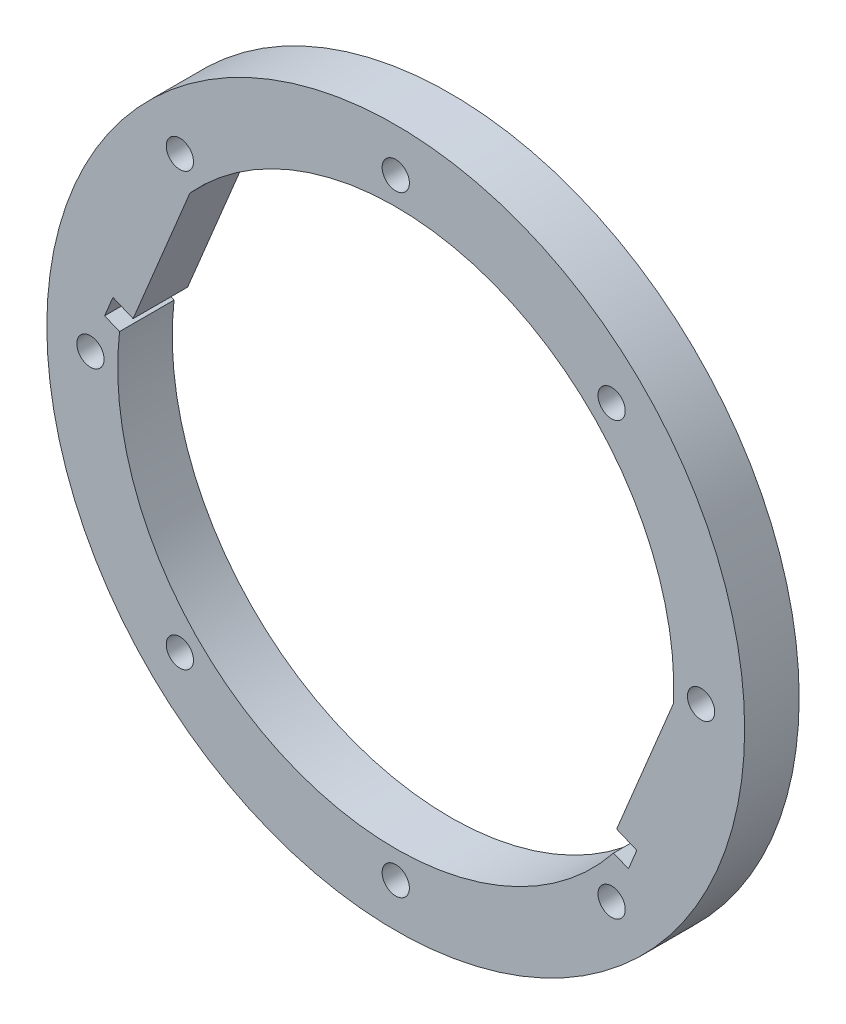
ISO-10303-21;
HEADER;
FILE_DESCRIPTION(('STEP AP214'),'2;1');
FILE_NAME('part.step','',(''),(''),'','','');
FILE_SCHEMA(('AUTOMOTIVE_DESIGN { 1 0 10303 214 1 1 1 1 }'));
ENDSEC;
DATA;
#1=APPLICATION_CONTEXT('core data for automotive mechanical design processes');
#2=APPLICATION_PROTOCOL_DEFINITION('international standard','automotive_design',2000,#1);
#3=PRODUCT_CONTEXT('',#1,'mechanical');
#4=PRODUCT('Part','Part','',(#3));
#5=PRODUCT_RELATED_PRODUCT_CATEGORY('part','',(#4));
#6=PRODUCT_DEFINITION_FORMATION('','',#4);
#7=PRODUCT_DEFINITION_CONTEXT('part definition',#1,'design');
#8=PRODUCT_DEFINITION('design','',#6,#7);
#9=PRODUCT_DEFINITION_SHAPE('','',#8);
#10=(LENGTH_UNIT() NAMED_UNIT(*) SI_UNIT(.MILLI.,.METRE.));
#11=(NAMED_UNIT(*) PLANE_ANGLE_UNIT() SI_UNIT($,.RADIAN.));
#12=(NAMED_UNIT(*) SI_UNIT($,.STERADIAN.) SOLID_ANGLE_UNIT());
#13=UNCERTAINTY_MEASURE_WITH_UNIT(LENGTH_MEASURE(1.E-05),#10,'distance_accuracy_value','');
#14=(GEOMETRIC_REPRESENTATION_CONTEXT(3) GLOBAL_UNCERTAINTY_ASSIGNED_CONTEXT((#13)) GLOBAL_UNIT_ASSIGNED_CONTEXT((#10,
#11,#12)) REPRESENTATION_CONTEXT('',''));
#15=CARTESIAN_POINT('',(0.,0.,0.));
#16=DIRECTION('',(0.,0.,1.));
#17=DIRECTION('',(1.,0.,0.));
#18=AXIS2_PLACEMENT_3D('',#15,#16,#17);
#19=CARTESIAN_POINT('',(0.,0.,5.));
#20=DIRECTION('',(0.,0.,-1.));
#21=DIRECTION('',(-1.,0.,0.));
#22=AXIS2_PLACEMENT_3D('',#19,#20,#21);
#23=CYLINDRICAL_SURFACE('',#22,32.);
#24=CARTESIAN_POINT('',(0.,0.,5.));
#25=DIRECTION('',(0.,0.,1.));
#26=DIRECTION('',(1.,0.,0.));
#27=AXIS2_PLACEMENT_3D('',#24,#25,#26);
#28=CIRCLE('',#27,32.);
#29=CARTESIAN_POINT('',(32.,0.,5.));
#30=VERTEX_POINT('',#29);
#31=EDGE_CURVE('E255',#30,#30,#28,.T.);
#32=ORIENTED_EDGE('',*,*,#31,.F.);
#33=EDGE_LOOP('',(#32));
#34=FACE_BOUND('',#33,.T.);
#35=CARTESIAN_POINT('',(0.,0.,0.));
#36=DIRECTION('',(0.,0.,1.));
#37=DIRECTION('',(1.,0.,0.));
#38=AXIS2_PLACEMENT_3D('',#35,#36,#37);
#39=CIRCLE('',#38,32.);
#40=CARTESIAN_POINT('',(32.,0.,0.));
#41=VERTEX_POINT('',#40);
#42=EDGE_CURVE('E195',#41,#41,#39,.T.);
#43=ORIENTED_EDGE('',*,*,#42,.T.);
#44=EDGE_LOOP('',(#43));
#45=FACE_BOUND('',#44,.T.);
#46=ADVANCED_FACE('F39',(#34,#45),#23,.T.);
#47=CARTESIAN_POINT('',(0.,0.,5.));
#48=DIRECTION('',(0.,0.,1.));
#49=DIRECTION('',(1.,0.,0.));
#50=AXIS2_PLACEMENT_3D('',#47,#48,#49);
#51=PLANE('',#50);
#52=CARTESIAN_POINT('',(0.,0.,5.));
#53=DIRECTION('',(0.,0.,1.));
#54=DIRECTION('',(1.,0.,0.));
#55=AXIS2_PLACEMENT_3D('',#52,#53,#54);
#56=CIRCLE('',#55,25.5);
#57=CARTESIAN_POINT('',(-25.3326794111072,2.91639398128352,5.));
#58=VERTEX_POINT('',#57);
#59=CARTESIAN_POINT('',(19.9751113579959,-15.8507074364415,5.));
#60=VERTEX_POINT('',#59);
#61=EDGE_CURVE('E54',#58,#60,#56,.T.);
#62=ORIENTED_EDGE('',*,*,#61,.F.);
#63=DIRECTION('',(0.923879532511287,-0.38268343236509,0.));
#64=VECTOR('',#63,1.);
#65=CARTESIAN_POINT('',(-2.67878402655563,-6.467156727579,5.));
#66=LINE('',#65,#64);
#67=CARTESIAN_POINT('',(-26.6996518718491,3.48261251391334,5.));
#68=VERTEX_POINT('',#67);
#69=EDGE_CURVE('E161',#68,#58,#66,.T.);
#70=ORIENTED_EDGE('',*,*,#69,.F.);
#71=DIRECTION('',(-0.382683432365089,-0.923879532511287,0.));
#72=VECTOR('',#71,1.);
#73=CARTESIAN_POINT('',(-24.0208678452935,9.94976924149231,5.));
#74=LINE('',#73,#72);
#75=CARTESIAN_POINT('',(-25.9342850071189,5.33037157893591,5.));
#76=VERTEX_POINT('',#75);
#77=EDGE_CURVE('E157',#76,#68,#74,.T.);
#78=ORIENTED_EDGE('',*,*,#77,.F.);
#79=DIRECTION('',(-0.923879532511288,0.382683432365087,0.));
#80=VECTOR('',#79,1.);
#81=CARTESIAN_POINT('',(-1.9134171618254,-4.61939766255636,5.));
#82=LINE('',#81,#80);
#83=CARTESIAN_POINT('',(-24.0865259420963,4.56500471420574,5.));
#84=VERTEX_POINT('',#83);
#85=EDGE_CURVE('E153',#84,#76,#82,.T.);
#86=ORIENTED_EDGE('',*,*,#85,.F.);
#87=DIRECTION('',(-0.38268343236509,-0.923879532511287,0.));
#88=VECTOR('',#87,1.);
#89=CARTESIAN_POINT('',(-22.1731087802709,9.18440237676217,5.));
#90=LINE('',#89,#88);
#91=CARTESIAN_POINT('',(-18.8755853537507,17.1453281553102,5.));
#92=VERTEX_POINT('',#91);
#93=EDGE_CURVE('E149',#92,#84,#90,.T.);
#94=ORIENTED_EDGE('',*,*,#93,.F.);
#95=CARTESIAN_POINT('',(25.4706322067911,-1.22347659821417,5.));
#96=VERTEX_POINT('',#95);
#97=EDGE_CURVE('E148',#96,#92,#56,.T.);
#98=ORIENTED_EDGE('',*,*,#97,.F.);
#99=DIRECTION('',(-0.382683432365089,-0.923879532511287,0.));
#100=VECTOR('',#99,1.);
#101=CARTESIAN_POINT('',(22.1731087802709,-9.18440237676214,5.));
#102=LINE('',#101,#100);
#103=CARTESIAN_POINT('',(20.2596916184454,-13.8038000393186,5.));
#104=VERTEX_POINT('',#103);
#105=EDGE_CURVE('E142',#96,#104,#102,.T.);
#106=ORIENTED_EDGE('',*,*,#105,.T.);
#107=DIRECTION('',(0.923879532511285,-0.382683432365093,0.));
#108=VECTOR('',#107,1.);
#109=CARTESIAN_POINT('',(-1.91341716182544,-4.61939766255637,5.));
#110=LINE('',#109,#108);
#111=CARTESIAN_POINT('',(22.107450683468,-14.5691669040488,5.));
#112=VERTEX_POINT('',#111);
#113=EDGE_CURVE('E138',#104,#112,#110,.T.);
#114=ORIENTED_EDGE('',*,*,#113,.T.);
#115=DIRECTION('',(-0.382683432365098,-0.923879532511283,0.));
#116=VECTOR('',#115,1.);
#117=CARTESIAN_POINT('',(24.0208678452934,-9.94976924149258,5.));
#118=LINE('',#117,#116);
#119=CARTESIAN_POINT('',(21.3420838187378,-16.4169259690714,5.));
#120=VERTEX_POINT('',#119);
#121=EDGE_CURVE('E119',#112,#120,#118,.T.);
#122=ORIENTED_EDGE('',*,*,#121,.T.);
#123=DIRECTION('',(-0.923879532511285,0.382683432365093,0.));
#124=VECTOR('',#123,1.);
#125=CARTESIAN_POINT('',(-2.67878402655563,-6.46715672757894,5.));
#126=LINE('',#125,#124);
#127=EDGE_CURVE('E129',#120,#60,#126,.T.);
#128=ORIENTED_EDGE('',*,*,#127,.T.);
#129=EDGE_LOOP('',(#62,#70,#78,#86,#94,#98,#106,#114,#122,#128));
#130=FACE_BOUND('',#129,.T.);
#131=CARTESIAN_POINT('',(0.,28.,5.));
#132=DIRECTION('',(0.,0.,1.));
#133=DIRECTION('',(1.,0.,0.));
#134=AXIS2_PLACEMENT_3D('',#131,#132,#133);
#135=CIRCLE('',#134,1.25);
#136=CARTESIAN_POINT('',(1.25,28.,5.));
#137=VERTEX_POINT('',#136);
#138=EDGE_CURVE('E196',#137,#137,#135,.T.);
#139=ORIENTED_EDGE('',*,*,#138,.F.);
#140=EDGE_LOOP('',(#139));
#141=FACE_BOUND('',#140,.T.);
#142=CARTESIAN_POINT('',(-19.7989898732231,19.7989898732236,5.));
#143=DIRECTION('',(0.,0.,1.));
#144=DIRECTION('',(1.,0.,0.));
#145=AXIS2_PLACEMENT_3D('',#142,#143,#144);
#146=CIRCLE('',#145,1.25);
#147=CARTESIAN_POINT('',(-18.5489898732231,19.7989898732236,5.));
#148=VERTEX_POINT('',#147);
#149=EDGE_CURVE('E168',#148,#148,#146,.T.);
#150=ORIENTED_EDGE('',*,*,#149,.F.);
#151=EDGE_LOOP('',(#150));
#152=FACE_BOUND('',#151,.T.);
#153=CARTESIAN_POINT('',(-19.7989898732235,-19.7989898732232,5.));
#154=DIRECTION('',(0.,0.,1.));
#155=DIRECTION('',(1.,0.,0.));
#156=AXIS2_PLACEMENT_3D('',#153,#154,#155);
#157=CIRCLE('',#156,1.25);
#158=CARTESIAN_POINT('',(-18.5489898732235,-19.7989898732232,5.));
#159=VERTEX_POINT('',#158);
#160=EDGE_CURVE('E214',#159,#159,#157,.T.);
#161=ORIENTED_EDGE('',*,*,#160,.F.);
#162=EDGE_LOOP('',(#161));
#163=FACE_BOUND('',#162,.T.);
#164=CARTESIAN_POINT('',(-1.90819582357449E-13,-28.,5.));
#165=DIRECTION('',(0.,0.,1.));
#166=DIRECTION('',(1.,0.,0.));
#167=AXIS2_PLACEMENT_3D('',#164,#165,#166);
#168=CIRCLE('',#167,1.25);
#169=CARTESIAN_POINT('',(1.24999999999981,-28.,5.));
#170=VERTEX_POINT('',#169);
#171=EDGE_CURVE('E206',#170,#170,#168,.T.);
#172=ORIENTED_EDGE('',*,*,#171,.F.);
#173=EDGE_LOOP('',(#172));
#174=FACE_BOUND('',#173,.T.);
#175=CARTESIAN_POINT('',(-28.,2.89102075612391E-13,5.));
#176=DIRECTION('',(0.,0.,1.));
#177=DIRECTION('',(1.,0.,0.));
#178=AXIS2_PLACEMENT_3D('',#175,#176,#177);
#179=CIRCLE('',#178,1.25);
#180=CARTESIAN_POINT('',(-26.75,2.89102075612391E-13,5.));
#181=VERTEX_POINT('',#180);
#182=EDGE_CURVE('E244',#181,#181,#179,.T.);
#183=ORIENTED_EDGE('',*,*,#182,.F.);
#184=EDGE_LOOP('',(#183));
#185=FACE_BOUND('',#184,.T.);
#186=CARTESIAN_POINT('',(19.7989898732236,19.798989873223,5.));
#187=DIRECTION('',(0.,0.,1.));
#188=DIRECTION('',(1.,0.,0.));
#189=AXIS2_PLACEMENT_3D('',#186,#187,#188);
#190=CIRCLE('',#189,1.25);
#191=CARTESIAN_POINT('',(21.0489898732236,19.798989873223,5.));
#192=VERTEX_POINT('',#191);
#193=EDGE_CURVE('E229',#192,#192,#190,.T.);
#194=ORIENTED_EDGE('',*,*,#193,.F.);
#195=EDGE_LOOP('',(#194));
#196=FACE_BOUND('',#195,.T.);
#197=CARTESIAN_POINT('',(28.,-4.83987849797529E-13,5.));
#198=DIRECTION('',(0.,0.,1.));
#199=DIRECTION('',(1.,0.,0.));
#200=AXIS2_PLACEMENT_3D('',#197,#198,#199);
#201=CIRCLE('',#200,1.25);
#202=CARTESIAN_POINT('',(29.25,-4.83987849797529E-13,5.));
#203=VERTEX_POINT('',#202);
#204=EDGE_CURVE('E230',#203,#203,#201,.T.);
#205=ORIENTED_EDGE('',*,*,#204,.F.);
#206=EDGE_LOOP('',(#205));
#207=FACE_BOUND('',#206,.T.);
#208=CARTESIAN_POINT('',(19.7989898732232,-19.7989898732234,5.));
#209=DIRECTION('',(0.,0.,1.));
#210=DIRECTION('',(1.,0.,0.));
#211=AXIS2_PLACEMENT_3D('',#208,#209,#210);
#212=CIRCLE('',#211,1.25);
#213=CARTESIAN_POINT('',(21.0489898732232,-19.7989898732234,5.));
#214=VERTEX_POINT('',#213);
#215=EDGE_CURVE('E205',#214,#214,#212,.T.);
#216=ORIENTED_EDGE('',*,*,#215,.F.);
#217=EDGE_LOOP('',(#216));
#218=FACE_BOUND('',#217,.T.);
#219=ORIENTED_EDGE('',*,*,#31,.T.);
#220=EDGE_LOOP('',(#219));
#221=FACE_BOUND('',#220,.T.);
#222=ADVANCED_FACE('F134',(#130,#141,#152,#163,#174,#185,#196,#207,#218,#221),#51,.T.);
#223=CARTESIAN_POINT('',(0.,0.,0.));
#224=DIRECTION('',(0.,0.,1.));
#225=DIRECTION('',(1.,0.,0.));
#226=AXIS2_PLACEMENT_3D('',#223,#224,#225);
#227=PLANE('',#226);
#228=DIRECTION('',(0.923879532511287,-0.38268343236509,0.));
#229=VECTOR('',#228,1.);
#230=CARTESIAN_POINT('',(-2.67878402655563,-6.467156727579,0.));
#231=LINE('',#230,#229);
#232=CARTESIAN_POINT('',(-26.6996518718491,3.48261251391334,0.));
#233=VERTEX_POINT('',#232);
#234=CARTESIAN_POINT('',(-25.3326794111072,2.91639398128352,0.));
#235=VERTEX_POINT('',#234);
#236=EDGE_CURVE('E47',#233,#235,#231,.T.);
#237=ORIENTED_EDGE('',*,*,#236,.T.);
#238=CARTESIAN_POINT('',(0.,0.,0.));
#239=DIRECTION('',(0.,0.,1.));
#240=DIRECTION('',(1.,0.,0.));
#241=AXIS2_PLACEMENT_3D('',#238,#239,#240);
#242=CIRCLE('',#241,25.5);
#243=CARTESIAN_POINT('',(19.9751113579959,-15.8507074364415,0.));
#244=VERTEX_POINT('',#243);
#245=EDGE_CURVE('E11',#235,#244,#242,.T.);
#246=ORIENTED_EDGE('',*,*,#245,.T.);
#247=DIRECTION('',(-0.923879532511285,0.382683432365093,0.));
#248=VECTOR('',#247,1.);
#249=CARTESIAN_POINT('',(-2.67878402655563,-6.46715672757894,0.));
#250=LINE('',#249,#248);
#251=CARTESIAN_POINT('',(21.3420838187378,-16.4169259690714,0.));
#252=VERTEX_POINT('',#251);
#253=EDGE_CURVE('E259',#252,#244,#250,.T.);
#254=ORIENTED_EDGE('',*,*,#253,.F.);
#255=DIRECTION('',(-0.382683432365098,-0.923879532511283,0.));
#256=VECTOR('',#255,1.);
#257=CARTESIAN_POINT('',(24.0208678452934,-9.94976924149258,0.));
#258=LINE('',#257,#256);
#259=CARTESIAN_POINT('',(22.107450683468,-14.5691669040488,0.));
#260=VERTEX_POINT('',#259);
#261=EDGE_CURVE('E122',#260,#252,#258,.T.);
#262=ORIENTED_EDGE('',*,*,#261,.F.);
#263=DIRECTION('',(0.923879532511285,-0.382683432365093,0.));
#264=VECTOR('',#263,1.);
#265=CARTESIAN_POINT('',(-1.91341716182544,-4.61939766255637,0.));
#266=LINE('',#265,#264);
#267=CARTESIAN_POINT('',(20.2596916184454,-13.8038000393186,0.));
#268=VERTEX_POINT('',#267);
#269=EDGE_CURVE('E267',#268,#260,#266,.T.);
#270=ORIENTED_EDGE('',*,*,#269,.F.);
#271=DIRECTION('',(-0.382683432365089,-0.923879532511287,0.));
#272=VECTOR('',#271,1.);
#273=CARTESIAN_POINT('',(22.1731087802709,-9.18440237676214,0.));
#274=LINE('',#273,#272);
#275=CARTESIAN_POINT('',(25.4706322067911,-1.22347659821417,0.));
#276=VERTEX_POINT('',#275);
#277=EDGE_CURVE('E270',#276,#268,#274,.T.);
#278=ORIENTED_EDGE('',*,*,#277,.F.);
#279=CARTESIAN_POINT('',(0.,0.,0.));
#280=DIRECTION('',(0.,0.,1.));
#281=DIRECTION('',(1.,0.,0.));
#282=AXIS2_PLACEMENT_3D('',#279,#280,#281);
#283=CIRCLE('',#282,25.5);
#284=CARTESIAN_POINT('',(-18.8755853537507,17.1453281553102,0.));
#285=VERTEX_POINT('',#284);
#286=EDGE_CURVE('E273',#276,#285,#283,.T.);
#287=ORIENTED_EDGE('',*,*,#286,.T.);
#288=DIRECTION('',(-0.38268343236509,-0.923879532511287,0.));
#289=VECTOR('',#288,1.);
#290=CARTESIAN_POINT('',(-22.1731087802709,9.18440237676217,0.));
#291=LINE('',#290,#289);
#292=CARTESIAN_POINT('',(-24.0865259420963,4.56500471420574,0.));
#293=VERTEX_POINT('',#292);
#294=EDGE_CURVE('E277',#285,#293,#291,.T.);
#295=ORIENTED_EDGE('',*,*,#294,.T.);
#296=DIRECTION('',(-0.923879532511288,0.382683432365087,0.));
#297=VECTOR('',#296,1.);
#298=CARTESIAN_POINT('',(-1.9134171618254,-4.61939766255636,0.));
#299=LINE('',#298,#297);
#300=CARTESIAN_POINT('',(-25.9342850071189,5.33037157893591,0.));
#301=VERTEX_POINT('',#300);
#302=EDGE_CURVE('E281',#293,#301,#299,.T.);
#303=ORIENTED_EDGE('',*,*,#302,.T.);
#304=DIRECTION('',(-0.382683432365089,-0.923879532511287,0.));
#305=VECTOR('',#304,1.);
#306=CARTESIAN_POINT('',(-24.0208678452935,9.94976924149231,0.));
#307=LINE('',#306,#305);
#308=EDGE_CURVE('E285',#301,#233,#307,.T.);
#309=ORIENTED_EDGE('',*,*,#308,.T.);
#310=EDGE_LOOP('',(#237,#246,#254,#262,#270,#278,#287,#295,#303,#309));
#311=FACE_BOUND('',#310,.T.);
#312=CARTESIAN_POINT('',(0.,28.,0.));
#313=DIRECTION('',(0.,0.,1.));
#314=DIRECTION('',(1.,0.,0.));
#315=AXIS2_PLACEMENT_3D('',#312,#313,#314);
#316=CIRCLE('',#315,1.25);
#317=CARTESIAN_POINT('',(1.25,28.,0.));
#318=VERTEX_POINT('',#317);
#319=EDGE_CURVE('E191',#318,#318,#316,.T.);
#320=ORIENTED_EDGE('',*,*,#319,.T.);
#321=EDGE_LOOP('',(#320));
#322=FACE_BOUND('',#321,.T.);
#323=CARTESIAN_POINT('',(-19.7989898732231,19.7989898732236,0.));
#324=DIRECTION('',(0.,0.,1.));
#325=DIRECTION('',(1.,0.,0.));
#326=AXIS2_PLACEMENT_3D('',#323,#324,#325);
#327=CIRCLE('',#326,1.25);
#328=CARTESIAN_POINT('',(-18.5489898732231,19.7989898732236,0.));
#329=VERTEX_POINT('',#328);
#330=EDGE_CURVE('E218',#329,#329,#327,.T.);
#331=ORIENTED_EDGE('',*,*,#330,.T.);
#332=EDGE_LOOP('',(#331));
#333=FACE_BOUND('',#332,.T.);
#334=CARTESIAN_POINT('',(-19.7989898732235,-19.7989898732232,0.));
#335=DIRECTION('',(0.,0.,1.));
#336=DIRECTION('',(1.,0.,0.));
#337=AXIS2_PLACEMENT_3D('',#334,#335,#336);
#338=CIRCLE('',#337,1.25);
#339=CARTESIAN_POINT('',(-18.5489898732235,-19.7989898732232,0.));
#340=VERTEX_POINT('',#339);
#341=EDGE_CURVE('E210',#340,#340,#338,.T.);
#342=ORIENTED_EDGE('',*,*,#341,.T.);
#343=EDGE_LOOP('',(#342));
#344=FACE_BOUND('',#343,.T.);
#345=CARTESIAN_POINT('',(-1.90819582357449E-13,-28.,0.));
#346=DIRECTION('',(0.,0.,1.));
#347=DIRECTION('',(1.,0.,0.));
#348=AXIS2_PLACEMENT_3D('',#345,#346,#347);
#349=CIRCLE('',#348,1.25);
#350=CARTESIAN_POINT('',(1.24999999999981,-28.,0.));
#351=VERTEX_POINT('',#350);
#352=EDGE_CURVE('E201',#351,#351,#349,.T.);
#353=ORIENTED_EDGE('',*,*,#352,.T.);
#354=EDGE_LOOP('',(#353));
#355=FACE_BOUND('',#354,.T.);
#356=CARTESIAN_POINT('',(-28.,2.89102075612391E-13,0.));
#357=DIRECTION('',(0.,0.,1.));
#358=DIRECTION('',(1.,0.,0.));
#359=AXIS2_PLACEMENT_3D('',#356,#357,#358);
#360=CIRCLE('',#359,1.25);
#361=CARTESIAN_POINT('',(-26.75,2.89102075612391E-13,0.));
#362=VERTEX_POINT('',#361);
#363=EDGE_CURVE('E200',#362,#362,#360,.T.);
#364=ORIENTED_EDGE('',*,*,#363,.T.);
#365=EDGE_LOOP('',(#364));
#366=FACE_BOUND('',#365,.T.);
#367=CARTESIAN_POINT('',(19.7989898732236,19.798989873223,0.));
#368=DIRECTION('',(0.,0.,1.));
#369=DIRECTION('',(1.,0.,0.));
#370=AXIS2_PLACEMENT_3D('',#367,#368,#369);
#371=CIRCLE('',#370,1.25);
#372=CARTESIAN_POINT('',(21.0489898732236,19.798989873223,0.));
#373=VERTEX_POINT('',#372);
#374=EDGE_CURVE('E248',#373,#373,#371,.T.);
#375=ORIENTED_EDGE('',*,*,#374,.T.);
#376=EDGE_LOOP('',(#375));
#377=FACE_BOUND('',#376,.T.);
#378=CARTESIAN_POINT('',(28.,-4.83987849797529E-13,0.));
#379=DIRECTION('',(0.,0.,1.));
#380=DIRECTION('',(1.,0.,0.));
#381=AXIS2_PLACEMENT_3D('',#378,#379,#380);
#382=CIRCLE('',#381,1.25);
#383=CARTESIAN_POINT('',(29.25,-4.83987849797529E-13,0.));
#384=VERTEX_POINT('',#383);
#385=EDGE_CURVE('E225',#384,#384,#382,.T.);
#386=ORIENTED_EDGE('',*,*,#385,.T.);
#387=EDGE_LOOP('',(#386));
#388=FACE_BOUND('',#387,.T.);
#389=CARTESIAN_POINT('',(19.7989898732232,-19.7989898732234,0.));
#390=DIRECTION('',(0.,0.,1.));
#391=DIRECTION('',(1.,0.,0.));
#392=AXIS2_PLACEMENT_3D('',#389,#390,#391);
#393=CIRCLE('',#392,1.25);
#394=CARTESIAN_POINT('',(21.0489898732232,-19.7989898732234,0.));
#395=VERTEX_POINT('',#394);
#396=EDGE_CURVE('E234',#395,#395,#393,.T.);
#397=ORIENTED_EDGE('',*,*,#396,.T.);
#398=EDGE_LOOP('',(#397));
#399=FACE_BOUND('',#398,.T.);
#400=ORIENTED_EDGE('',*,*,#42,.F.);
#401=EDGE_LOOP('',(#400));
#402=FACE_BOUND('',#401,.T.);
#403=ADVANCED_FACE('F291',(#311,#322,#333,#344,#355,#366,#377,#388,#399,#402),#227,.F.);
#404=CARTESIAN_POINT('',(19.7989898732232,-19.7989898732234,0.));
#405=DIRECTION('',(0.,0.,1.));
#406=DIRECTION('',(1.,0.,0.));
#407=AXIS2_PLACEMENT_3D('',#404,#405,#406);
#408=CYLINDRICAL_SURFACE('',#407,1.25);
#409=ORIENTED_EDGE('',*,*,#396,.F.);
#410=EDGE_LOOP('',(#409));
#411=FACE_BOUND('',#410,.T.);
#412=ORIENTED_EDGE('',*,*,#215,.T.);
#413=EDGE_LOOP('',(#412));
#414=FACE_BOUND('',#413,.T.);
#415=ADVANCED_FACE('F349',(#411,#414),#408,.F.);
#416=CARTESIAN_POINT('',(28.,-4.83987849797529E-13,0.));
#417=DIRECTION('',(0.,0.,1.));
#418=DIRECTION('',(1.,0.,0.));
#419=AXIS2_PLACEMENT_3D('',#416,#417,#418);
#420=CYLINDRICAL_SURFACE('',#419,1.25);
#421=ORIENTED_EDGE('',*,*,#385,.F.);
#422=EDGE_LOOP('',(#421));
#423=FACE_BOUND('',#422,.T.);
#424=ORIENTED_EDGE('',*,*,#204,.T.);
#425=EDGE_LOOP('',(#424));
#426=FACE_BOUND('',#425,.T.);
#427=ADVANCED_FACE('F353',(#423,#426),#420,.F.);
#428=CARTESIAN_POINT('',(19.7989898732236,19.798989873223,0.));
#429=DIRECTION('',(0.,0.,1.));
#430=DIRECTION('',(1.,0.,0.));
#431=AXIS2_PLACEMENT_3D('',#428,#429,#430);
#432=CYLINDRICAL_SURFACE('',#431,1.25);
#433=ORIENTED_EDGE('',*,*,#374,.F.);
#434=EDGE_LOOP('',(#433));
#435=FACE_BOUND('',#434,.T.);
#436=ORIENTED_EDGE('',*,*,#193,.T.);
#437=EDGE_LOOP('',(#436));
#438=FACE_BOUND('',#437,.T.);
#439=ADVANCED_FACE('F357',(#435,#438),#432,.F.);
#440=CARTESIAN_POINT('',(-28.,2.89102075612391E-13,0.));
#441=DIRECTION('',(0.,0.,1.));
#442=DIRECTION('',(1.,0.,0.));
#443=AXIS2_PLACEMENT_3D('',#440,#441,#442);
#444=CYLINDRICAL_SURFACE('',#443,1.25);
#445=ORIENTED_EDGE('',*,*,#363,.F.);
#446=EDGE_LOOP('',(#445));
#447=FACE_BOUND('',#446,.T.);
#448=ORIENTED_EDGE('',*,*,#182,.T.);
#449=EDGE_LOOP('',(#448));
#450=FACE_BOUND('',#449,.T.);
#451=ADVANCED_FACE('F360',(#447,#450),#444,.F.);
#452=CARTESIAN_POINT('',(-1.90819582357449E-13,-28.,0.));
#453=DIRECTION('',(0.,0.,1.));
#454=DIRECTION('',(1.,0.,0.));
#455=AXIS2_PLACEMENT_3D('',#452,#453,#454);
#456=CYLINDRICAL_SURFACE('',#455,1.25);
#457=ORIENTED_EDGE('',*,*,#352,.F.);
#458=EDGE_LOOP('',(#457));
#459=FACE_BOUND('',#458,.T.);
#460=ORIENTED_EDGE('',*,*,#171,.T.);
#461=EDGE_LOOP('',(#460));
#462=FACE_BOUND('',#461,.T.);
#463=ADVANCED_FACE('F363',(#459,#462),#456,.F.);
#464=CARTESIAN_POINT('',(-19.7989898732235,-19.7989898732232,0.));
#465=DIRECTION('',(0.,0.,1.));
#466=DIRECTION('',(1.,0.,0.));
#467=AXIS2_PLACEMENT_3D('',#464,#465,#466);
#468=CYLINDRICAL_SURFACE('',#467,1.25);
#469=ORIENTED_EDGE('',*,*,#341,.F.);
#470=EDGE_LOOP('',(#469));
#471=FACE_BOUND('',#470,.T.);
#472=ORIENTED_EDGE('',*,*,#160,.T.);
#473=EDGE_LOOP('',(#472));
#474=FACE_BOUND('',#473,.T.);
#475=ADVANCED_FACE('F371',(#471,#474),#468,.F.);
#476=CARTESIAN_POINT('',(-19.7989898732231,19.7989898732236,0.));
#477=DIRECTION('',(0.,0.,1.));
#478=DIRECTION('',(1.,0.,0.));
#479=AXIS2_PLACEMENT_3D('',#476,#477,#478);
#480=CYLINDRICAL_SURFACE('',#479,1.25);
#481=ORIENTED_EDGE('',*,*,#330,.F.);
#482=EDGE_LOOP('',(#481));
#483=FACE_BOUND('',#482,.T.);
#484=ORIENTED_EDGE('',*,*,#149,.T.);
#485=EDGE_LOOP('',(#484));
#486=FACE_BOUND('',#485,.T.);
#487=ADVANCED_FACE('F332',(#483,#486),#480,.F.);
#488=CARTESIAN_POINT('',(0.,28.,0.));
#489=DIRECTION('',(0.,0.,1.));
#490=DIRECTION('',(1.,0.,0.));
#491=AXIS2_PLACEMENT_3D('',#488,#489,#490);
#492=CYLINDRICAL_SURFACE('',#491,1.25);
#493=ORIENTED_EDGE('',*,*,#319,.F.);
#494=EDGE_LOOP('',(#493));
#495=FACE_BOUND('',#494,.T.);
#496=ORIENTED_EDGE('',*,*,#138,.T.);
#497=EDGE_LOOP('',(#496));
#498=FACE_BOUND('',#497,.T.);
#499=ADVANCED_FACE('F325',(#495,#498),#492,.F.);
#500=CARTESIAN_POINT('',(0.,0.,-5.));
#501=DIRECTION('',(0.,0.,1.));
#502=DIRECTION('',(1.,0.,0.));
#503=AXIS2_PLACEMENT_3D('',#500,#501,#502);
#504=CYLINDRICAL_SURFACE('',#503,25.5);
#505=DIRECTION('',(0.,0.,1.));
#506=VECTOR('',#505,1.);
#507=CARTESIAN_POINT('',(-25.3326794111072,2.91639398128352,-5.));
#508=LINE('',#507,#506);
#509=EDGE_CURVE('E165',#235,#58,#508,.T.);
#510=ORIENTED_EDGE('',*,*,#509,.T.);
#511=ORIENTED_EDGE('',*,*,#61,.T.);
#512=DIRECTION('',(0.,0.,1.));
#513=VECTOR('',#512,1.);
#514=CARTESIAN_POINT('',(19.9751113579959,-15.8507074364415,-5.));
#515=LINE('',#514,#513);
#516=EDGE_CURVE('E126',#244,#60,#515,.T.);
#517=ORIENTED_EDGE('',*,*,#516,.F.);
#518=ORIENTED_EDGE('',*,*,#245,.F.);
#519=EDGE_LOOP('',(#510,#511,#517,#518));
#520=FACE_BOUND('',#519,.T.);
#521=ADVANCED_FACE('F323',(#520),#504,.F.);
#522=CARTESIAN_POINT('',(-2.67878402655563,-6.467156727579,-5.));
#523=DIRECTION('',(-0.38268343236509,-0.923879532511287,0.));
#524=DIRECTION('',(0.923879532511287,-0.38268343236509,0.));
#525=AXIS2_PLACEMENT_3D('',#522,#523,#524);
#526=PLANE('',#525);
#527=DIRECTION('',(0.,0.,1.));
#528=VECTOR('',#527,1.);
#529=CARTESIAN_POINT('',(-26.6996518718491,3.48261251391334,-5.));
#530=LINE('',#529,#528);
#531=EDGE_CURVE('E169',#233,#68,#530,.T.);
#532=ORIENTED_EDGE('',*,*,#531,.T.);
#533=ORIENTED_EDGE('',*,*,#69,.T.);
#534=ORIENTED_EDGE('',*,*,#509,.F.);
#535=ORIENTED_EDGE('',*,*,#236,.F.);
#536=EDGE_LOOP('',(#532,#533,#534,#535));
#537=FACE_BOUND('',#536,.T.);
#538=ADVANCED_FACE('F296',(#537),#526,.F.);
#539=CARTESIAN_POINT('',(-24.0208678452935,9.94976924149231,-5.));
#540=DIRECTION('',(-0.923879532511287,0.382683432365089,0.));
#541=DIRECTION('',(-0.382683432365089,-0.923879532511287,0.));
#542=AXIS2_PLACEMENT_3D('',#539,#540,#541);
#543=PLANE('',#542);
#544=DIRECTION('',(0.,0.,1.));
#545=VECTOR('',#544,1.);
#546=CARTESIAN_POINT('',(-25.9342850071189,5.33037157893591,-5.));
#547=LINE('',#546,#545);
#548=EDGE_CURVE('E172',#301,#76,#547,.T.);
#549=ORIENTED_EDGE('',*,*,#548,.T.);
#550=ORIENTED_EDGE('',*,*,#77,.T.);
#551=ORIENTED_EDGE('',*,*,#531,.F.);
#552=ORIENTED_EDGE('',*,*,#308,.F.);
#553=EDGE_LOOP('',(#549,#550,#551,#552));
#554=FACE_BOUND('',#553,.T.);
#555=ADVANCED_FACE('F298',(#554),#543,.F.);
#556=CARTESIAN_POINT('',(-1.9134171618254,-4.61939766255636,-5.));
#557=DIRECTION('',(0.382683432365087,0.923879532511288,0.));
#558=DIRECTION('',(-0.923879532511288,0.382683432365087,0.));
#559=AXIS2_PLACEMENT_3D('',#556,#557,#558);
#560=PLANE('',#559);
#561=DIRECTION('',(0.,0.,1.));
#562=VECTOR('',#561,1.);
#563=CARTESIAN_POINT('',(-24.0865259420963,4.56500471420574,-5.));
#564=LINE('',#563,#562);
#565=EDGE_CURVE('E175',#293,#84,#564,.T.);
#566=ORIENTED_EDGE('',*,*,#565,.T.);
#567=ORIENTED_EDGE('',*,*,#85,.T.);
#568=ORIENTED_EDGE('',*,*,#548,.F.);
#569=ORIENTED_EDGE('',*,*,#302,.F.);
#570=EDGE_LOOP('',(#566,#567,#568,#569));
#571=FACE_BOUND('',#570,.T.);
#572=ADVANCED_FACE('F421',(#571),#560,.F.);
#573=CARTESIAN_POINT('',(-22.1731087802709,9.18440237676217,-5.));
#574=DIRECTION('',(-0.923879532511286,0.38268343236509,0.));
#575=DIRECTION('',(-0.38268343236509,-0.923879532511287,0.));
#576=AXIS2_PLACEMENT_3D('',#573,#574,#575);
#577=PLANE('',#576);
#578=DIRECTION('',(0.,0.,1.));
#579=VECTOR('',#578,1.);
#580=CARTESIAN_POINT('',(-18.8755853537507,17.1453281553102,-5.));
#581=LINE('',#580,#579);
#582=EDGE_CURVE('E178',#285,#92,#581,.T.);
#583=ORIENTED_EDGE('',*,*,#582,.T.);
#584=ORIENTED_EDGE('',*,*,#93,.T.);
#585=ORIENTED_EDGE('',*,*,#565,.F.);
#586=ORIENTED_EDGE('',*,*,#294,.F.);
#587=EDGE_LOOP('',(#583,#584,#585,#586));
#588=FACE_BOUND('',#587,.T.);
#589=ADVANCED_FACE('F315',(#588),#577,.F.);
#590=DIRECTION('',(0.,0.,1.));
#591=VECTOR('',#590,1.);
#592=CARTESIAN_POINT('',(25.4706322067911,-1.22347659821417,-5.));
#593=LINE('',#592,#591);
#594=EDGE_CURVE('E181',#276,#96,#593,.T.);
#595=ORIENTED_EDGE('',*,*,#594,.T.);
#596=ORIENTED_EDGE('',*,*,#97,.T.);
#597=ORIENTED_EDGE('',*,*,#582,.F.);
#598=ORIENTED_EDGE('',*,*,#286,.F.);
#599=EDGE_LOOP('',(#595,#596,#597,#598));
#600=FACE_BOUND('',#599,.T.);
#601=ADVANCED_FACE('F310',(#600),#504,.F.);
#602=CARTESIAN_POINT('',(22.1731087802709,-9.18440237676214,-5.));
#603=DIRECTION('',(-0.923879532511287,0.382683432365089,0.));
#604=DIRECTION('',(-0.382683432365089,-0.923879532511287,0.));
#605=AXIS2_PLACEMENT_3D('',#602,#603,#604);
#606=PLANE('',#605);
#607=ORIENTED_EDGE('',*,*,#277,.T.);
#608=DIRECTION('',(0.,0.,1.));
#609=VECTOR('',#608,1.);
#610=CARTESIAN_POINT('',(20.2596916184454,-13.8038000393186,-5.));
#611=LINE('',#610,#609);
#612=EDGE_CURVE('E184',#268,#104,#611,.T.);
#613=ORIENTED_EDGE('',*,*,#612,.T.);
#614=ORIENTED_EDGE('',*,*,#105,.F.);
#615=ORIENTED_EDGE('',*,*,#594,.F.);
#616=EDGE_LOOP('',(#607,#613,#614,#615));
#617=FACE_BOUND('',#616,.T.);
#618=ADVANCED_FACE('F319',(#617),#606,.T.);
#619=CARTESIAN_POINT('',(-1.91341716182544,-4.61939766255637,-5.));
#620=DIRECTION('',(-0.382683432365093,-0.923879532511285,0.));
#621=DIRECTION('',(0.923879532511285,-0.382683432365093,0.));
#622=AXIS2_PLACEMENT_3D('',#619,#620,#621);
#623=PLANE('',#622);
#624=ORIENTED_EDGE('',*,*,#269,.T.);
#625=DIRECTION('',(0.,0.,1.));
#626=VECTOR('',#625,1.);
#627=CARTESIAN_POINT('',(22.107450683468,-14.5691669040488,-5.));
#628=LINE('',#627,#626);
#629=EDGE_CURVE('E125',#260,#112,#628,.T.);
#630=ORIENTED_EDGE('',*,*,#629,.T.);
#631=ORIENTED_EDGE('',*,*,#113,.F.);
#632=ORIENTED_EDGE('',*,*,#612,.F.);
#633=EDGE_LOOP('',(#624,#630,#631,#632));
#634=FACE_BOUND('',#633,.T.);
#635=ADVANCED_FACE('F322',(#634),#623,.T.);
#636=CARTESIAN_POINT('',(24.0208678452934,-9.94976924149258,-5.));
#637=DIRECTION('',(-0.923879532511283,0.382683432365098,0.));
#638=DIRECTION('',(-0.382683432365098,-0.923879532511283,0.));
#639=AXIS2_PLACEMENT_3D('',#636,#637,#638);
#640=PLANE('',#639);
#641=ORIENTED_EDGE('',*,*,#261,.T.);
#642=DIRECTION('',(0.,0.,1.));
#643=VECTOR('',#642,1.);
#644=CARTESIAN_POINT('',(21.3420838187378,-16.4169259690714,-5.));
#645=LINE('',#644,#643);
#646=EDGE_CURVE('E62',#252,#120,#645,.T.);
#647=ORIENTED_EDGE('',*,*,#646,.T.);
#648=ORIENTED_EDGE('',*,*,#121,.F.);
#649=ORIENTED_EDGE('',*,*,#629,.F.);
#650=EDGE_LOOP('',(#641,#647,#648,#649));
#651=FACE_BOUND('',#650,.T.);
#652=ADVANCED_FACE('F116',(#651),#640,.T.);
#653=CARTESIAN_POINT('',(-2.67878402655563,-6.46715672757894,-5.));
#654=DIRECTION('',(0.382683432365093,0.923879532511285,0.));
#655=DIRECTION('',(-0.923879532511285,0.382683432365093,0.));
#656=AXIS2_PLACEMENT_3D('',#653,#654,#655);
#657=PLANE('',#656);
#658=ORIENTED_EDGE('',*,*,#253,.T.);
#659=ORIENTED_EDGE('',*,*,#516,.T.);
#660=ORIENTED_EDGE('',*,*,#127,.F.);
#661=ORIENTED_EDGE('',*,*,#646,.F.);
#662=EDGE_LOOP('',(#658,#659,#660,#661));
#663=FACE_BOUND('',#662,.T.);
#664=ADVANCED_FACE('F130',(#663),#657,.T.);
#665=CLOSED_SHELL('',(#46,#222,#403,#415,#427,#439,#451,#463,#475,#487,#499,#521,#538,#555,#572,
#589,#601,#618,#635,#652,#664));
#666=MANIFOLD_SOLID_BREP('B2',#665);
#667=ADVANCED_BREP_SHAPE_REPRESENTATION('',(#18,#666),#14);
#668=SHAPE_DEFINITION_REPRESENTATION(#9,#667);
ENDSEC;
END-ISO-10303-21;
